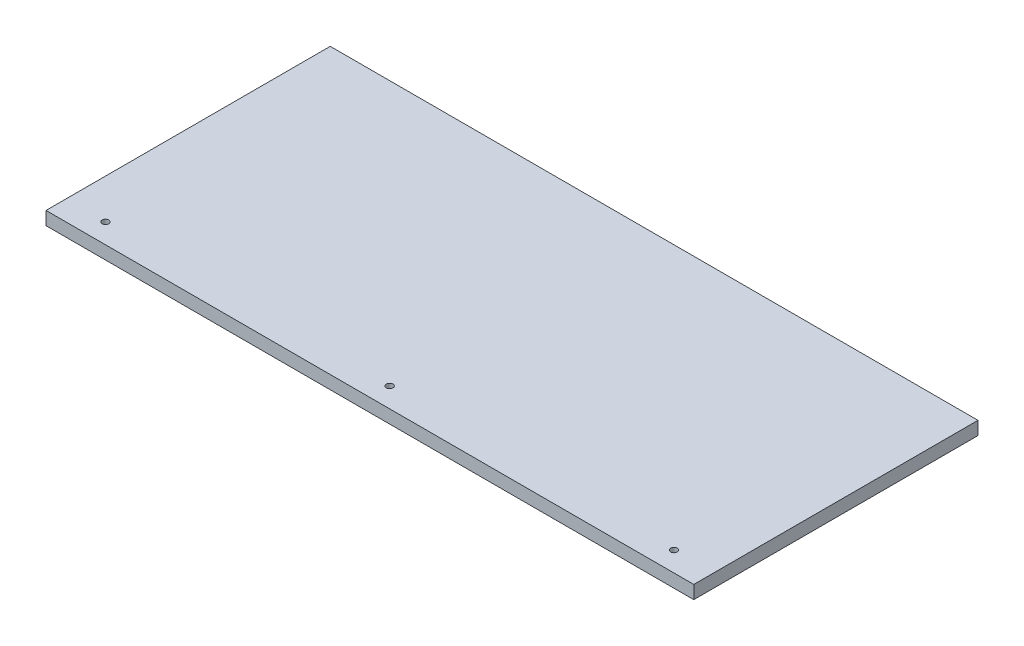
ISO-10303-21;
HEADER;
FILE_DESCRIPTION(('STEP AP214'),'2;1');
FILE_NAME('part.step','',(''),(''),'','','');
FILE_SCHEMA(('AUTOMOTIVE_DESIGN { 1 0 10303 214 1 1 1 1 }'));
ENDSEC;
DATA;
#1=APPLICATION_CONTEXT('core data for automotive mechanical design processes');
#2=APPLICATION_PROTOCOL_DEFINITION('international standard','automotive_design',2000,#1);
#3=PRODUCT_CONTEXT('',#1,'mechanical');
#4=PRODUCT('Part','Part','',(#3));
#5=PRODUCT_RELATED_PRODUCT_CATEGORY('part','',(#4));
#6=PRODUCT_DEFINITION_FORMATION('','',#4);
#7=PRODUCT_DEFINITION_CONTEXT('part definition',#1,'design');
#8=PRODUCT_DEFINITION('design','',#6,#7);
#9=PRODUCT_DEFINITION_SHAPE('','',#8);
#10=(LENGTH_UNIT() NAMED_UNIT(*) SI_UNIT(.MILLI.,.METRE.));
#11=(NAMED_UNIT(*) PLANE_ANGLE_UNIT() SI_UNIT($,.RADIAN.));
#12=(NAMED_UNIT(*) SI_UNIT($,.STERADIAN.) SOLID_ANGLE_UNIT());
#13=UNCERTAINTY_MEASURE_WITH_UNIT(LENGTH_MEASURE(1.E-05),#10,'distance_accuracy_value','');
#14=(GEOMETRIC_REPRESENTATION_CONTEXT(3) GLOBAL_UNCERTAINTY_ASSIGNED_CONTEXT((#13)) GLOBAL_UNIT_ASSIGNED_CONTEXT((#10,
#11,#12)) REPRESENTATION_CONTEXT('',''));
#15=CARTESIAN_POINT('',(0.,0.,0.));
#16=DIRECTION('',(0.,0.,1.));
#17=DIRECTION('',(1.,0.,0.));
#18=AXIS2_PLACEMENT_3D('',#15,#16,#17);
#19=CARTESIAN_POINT('',(0.,10.,0.));
#20=DIRECTION('',(1.,0.,0.));
#21=DIRECTION('',(0.,0.,-1.));
#22=AXIS2_PLACEMENT_3D('',#19,#20,#21);
#23=PLANE('',#22);
#24=DIRECTION('',(0.,0.,1.));
#25=VECTOR('',#24,1.);
#26=CARTESIAN_POINT('',(0.,0.,0.));
#27=LINE('',#26,#25);
#28=CARTESIAN_POINT('',(0.,0.,-215.));
#29=VERTEX_POINT('',#28);
#30=CARTESIAN_POINT('',(0.,0.,0.));
#31=VERTEX_POINT('',#30);
#32=EDGE_CURVE('E97',#29,#31,#27,.T.);
#33=ORIENTED_EDGE('',*,*,#32,.T.);
#34=DIRECTION('',(0.,-1.,0.));
#35=VECTOR('',#34,1.);
#36=CARTESIAN_POINT('',(0.,10.,0.));
#37=LINE('',#36,#35);
#38=CARTESIAN_POINT('',(0.,10.,0.));
#39=VERTEX_POINT('',#38);
#40=EDGE_CURVE('E11',#39,#31,#37,.T.);
#41=ORIENTED_EDGE('',*,*,#40,.F.);
#42=DIRECTION('',(0.,0.,1.));
#43=VECTOR('',#42,1.);
#44=CARTESIAN_POINT('',(0.,10.,0.));
#45=LINE('',#44,#43);
#46=CARTESIAN_POINT('',(0.,10.,-215.));
#47=VERTEX_POINT('',#46);
#48=EDGE_CURVE('E85',#47,#39,#45,.T.);
#49=ORIENTED_EDGE('',*,*,#48,.F.);
#50=DIRECTION('',(0.,-1.,0.));
#51=VECTOR('',#50,1.);
#52=CARTESIAN_POINT('',(0.,10.,-215.));
#53=LINE('',#52,#51);
#54=EDGE_CURVE('E93',#47,#29,#53,.T.);
#55=ORIENTED_EDGE('',*,*,#54,.T.);
#56=EDGE_LOOP('',(#33,#41,#49,#55));
#57=FACE_BOUND('',#56,.T.);
#58=ADVANCED_FACE('F34',(#57),#23,.F.);
#59=CARTESIAN_POINT('',(0.,10.,0.));
#60=DIRECTION('',(0.,0.,-1.));
#61=DIRECTION('',(-1.,0.,0.));
#62=AXIS2_PLACEMENT_3D('',#59,#60,#61);
#63=PLANE('',#62);
#64=DIRECTION('',(1.,0.,0.));
#65=VECTOR('',#64,1.);
#66=CARTESIAN_POINT('',(0.,0.,0.));
#67=LINE('',#66,#65);
#68=CARTESIAN_POINT('',(490.,0.,0.));
#69=VERTEX_POINT('',#68);
#70=EDGE_CURVE('E89',#31,#69,#67,.T.);
#71=ORIENTED_EDGE('',*,*,#70,.T.);
#72=DIRECTION('',(0.,-1.,0.));
#73=VECTOR('',#72,1.);
#74=CARTESIAN_POINT('',(490.,10.,0.));
#75=LINE('',#74,#73);
#76=CARTESIAN_POINT('',(490.,10.,0.));
#77=VERTEX_POINT('',#76);
#78=EDGE_CURVE('E42',#77,#69,#75,.T.);
#79=ORIENTED_EDGE('',*,*,#78,.F.);
#80=DIRECTION('',(1.,0.,0.));
#81=VECTOR('',#80,1.);
#82=CARTESIAN_POINT('',(0.,10.,0.));
#83=LINE('',#82,#81);
#84=EDGE_CURVE('E80',#39,#77,#83,.T.);
#85=ORIENTED_EDGE('',*,*,#84,.F.);
#86=ORIENTED_EDGE('',*,*,#40,.T.);
#87=EDGE_LOOP('',(#71,#79,#85,#86));
#88=FACE_BOUND('',#87,.T.);
#89=ADVANCED_FACE('F88',(#88),#63,.F.);
#90=CARTESIAN_POINT('',(490.,10.,0.));
#91=DIRECTION('',(-1.,0.,0.));
#92=DIRECTION('',(0.,0.,1.));
#93=AXIS2_PLACEMENT_3D('',#90,#91,#92);
#94=PLANE('',#93);
#95=DIRECTION('',(0.,0.,-1.));
#96=VECTOR('',#95,1.);
#97=CARTESIAN_POINT('',(490.,0.,0.));
#98=LINE('',#97,#96);
#99=CARTESIAN_POINT('',(490.,0.,-215.));
#100=VERTEX_POINT('',#99);
#101=EDGE_CURVE('E67',#69,#100,#98,.T.);
#102=ORIENTED_EDGE('',*,*,#101,.T.);
#103=DIRECTION('',(0.,-1.,0.));
#104=VECTOR('',#103,1.);
#105=CARTESIAN_POINT('',(490.,10.,-215.));
#106=LINE('',#105,#104);
#107=CARTESIAN_POINT('',(490.,10.,-215.));
#108=VERTEX_POINT('',#107);
#109=EDGE_CURVE('E90',#108,#100,#106,.T.);
#110=ORIENTED_EDGE('',*,*,#109,.F.);
#111=DIRECTION('',(0.,0.,-1.));
#112=VECTOR('',#111,1.);
#113=CARTESIAN_POINT('',(490.,10.,0.));
#114=LINE('',#113,#112);
#115=EDGE_CURVE('E83',#77,#108,#114,.T.);
#116=ORIENTED_EDGE('',*,*,#115,.F.);
#117=ORIENTED_EDGE('',*,*,#78,.T.);
#118=EDGE_LOOP('',(#102,#110,#116,#117));
#119=FACE_BOUND('',#118,.T.);
#120=ADVANCED_FACE('F91',(#119),#94,.F.);
#121=CARTESIAN_POINT('',(0.,10.,-215.));
#122=DIRECTION('',(0.,0.,1.));
#123=DIRECTION('',(1.,0.,0.));
#124=AXIS2_PLACEMENT_3D('',#121,#122,#123);
#125=PLANE('',#124);
#126=DIRECTION('',(-1.,0.,0.));
#127=VECTOR('',#126,1.);
#128=CARTESIAN_POINT('',(0.,0.,-215.));
#129=LINE('',#128,#127);
#130=EDGE_CURVE('E73',#100,#29,#129,.T.);
#131=ORIENTED_EDGE('',*,*,#130,.T.);
#132=ORIENTED_EDGE('',*,*,#54,.F.);
#133=DIRECTION('',(-1.,0.,0.));
#134=VECTOR('',#133,1.);
#135=CARTESIAN_POINT('',(0.,10.,-215.));
#136=LINE('',#135,#134);
#137=EDGE_CURVE('E50',#108,#47,#136,.T.);
#138=ORIENTED_EDGE('',*,*,#137,.F.);
#139=ORIENTED_EDGE('',*,*,#109,.T.);
#140=EDGE_LOOP('',(#131,#132,#138,#139));
#141=FACE_BOUND('',#140,.T.);
#142=ADVANCED_FACE('F105',(#141),#125,.F.);
#143=CARTESIAN_POINT('',(0.,10.,0.));
#144=DIRECTION('',(0.,-1.,0.));
#145=DIRECTION('',(0.,0.,-1.));
#146=AXIS2_PLACEMENT_3D('',#143,#144,#145);
#147=PLANE('',#146);
#148=CARTESIAN_POINT('',(29.9999999999999,10.,-15.));
#149=DIRECTION('',(0.,1.,0.));
#150=DIRECTION('',(0.,0.,1.));
#151=AXIS2_PLACEMENT_3D('',#148,#149,#150);
#152=CIRCLE('',#151,2.5);
#153=CARTESIAN_POINT('',(29.9999999999999,10.,-12.5));
#154=VERTEX_POINT('',#153);
#155=EDGE_CURVE('E121',#154,#154,#152,.T.);
#156=ORIENTED_EDGE('',*,*,#155,.F.);
#157=EDGE_LOOP('',(#156));
#158=FACE_BOUND('',#157,.T.);
#159=CARTESIAN_POINT('',(460.,10.,-15.));
#160=DIRECTION('',(0.,1.,0.));
#161=DIRECTION('',(0.,0.,1.));
#162=AXIS2_PLACEMENT_3D('',#159,#160,#161);
#163=CIRCLE('',#162,2.50000000000002);
#164=CARTESIAN_POINT('',(460.,10.,-12.5));
#165=VERTEX_POINT('',#164);
#166=EDGE_CURVE('E114',#165,#165,#163,.T.);
#167=ORIENTED_EDGE('',*,*,#166,.F.);
#168=EDGE_LOOP('',(#167));
#169=FACE_BOUND('',#168,.T.);
#170=CARTESIAN_POINT('',(245.,10.,-15.));
#171=DIRECTION('',(0.,1.,0.));
#172=DIRECTION('',(0.,0.,1.));
#173=AXIS2_PLACEMENT_3D('',#170,#171,#172);
#174=CIRCLE('',#173,2.50000000000002);
#175=CARTESIAN_POINT('',(245.,10.,-12.5));
#176=VERTEX_POINT('',#175);
#177=EDGE_CURVE('E115',#176,#176,#174,.T.);
#178=ORIENTED_EDGE('',*,*,#177,.F.);
#179=EDGE_LOOP('',(#178));
#180=FACE_BOUND('',#179,.T.);
#181=ORIENTED_EDGE('',*,*,#48,.T.);
#182=ORIENTED_EDGE('',*,*,#84,.T.);
#183=ORIENTED_EDGE('',*,*,#115,.T.);
#184=ORIENTED_EDGE('',*,*,#137,.T.);
#185=EDGE_LOOP('',(#181,#182,#183,#184));
#186=FACE_BOUND('',#185,.T.);
#187=ADVANCED_FACE('F81',(#158,#169,#180,#186),#147,.F.);
#188=CARTESIAN_POINT('',(0.,0.,0.));
#189=DIRECTION('',(0.,-1.,0.));
#190=DIRECTION('',(0.,0.,-1.));
#191=AXIS2_PLACEMENT_3D('',#188,#189,#190);
#192=PLANE('',#191);
#193=CARTESIAN_POINT('',(29.9999999999999,0.,-15.));
#194=DIRECTION('',(0.,-1.,0.));
#195=DIRECTION('',(0.,0.,-1.));
#196=AXIS2_PLACEMENT_3D('',#193,#194,#195);
#197=CIRCLE('',#196,2.5);
#198=CARTESIAN_POINT('',(29.9999999999999,0.,-17.5));
#199=VERTEX_POINT('',#198);
#200=EDGE_CURVE('E100',#199,#199,#197,.F.);
#201=ORIENTED_EDGE('',*,*,#200,.T.);
#202=EDGE_LOOP('',(#201));
#203=FACE_BOUND('',#202,.T.);
#204=CARTESIAN_POINT('',(460.,0.,-15.));
#205=DIRECTION('',(0.,-1.,0.));
#206=DIRECTION('',(0.,0.,-1.));
#207=AXIS2_PLACEMENT_3D('',#204,#205,#206);
#208=CIRCLE('',#207,2.50000000000002);
#209=CARTESIAN_POINT('',(460.,0.,-17.5));
#210=VERTEX_POINT('',#209);
#211=EDGE_CURVE('E118',#210,#210,#208,.F.);
#212=ORIENTED_EDGE('',*,*,#211,.T.);
#213=EDGE_LOOP('',(#212));
#214=FACE_BOUND('',#213,.T.);
#215=CARTESIAN_POINT('',(245.,0.,-15.));
#216=DIRECTION('',(0.,-1.,0.));
#217=DIRECTION('',(0.,0.,-1.));
#218=AXIS2_PLACEMENT_3D('',#215,#216,#217);
#219=CIRCLE('',#218,2.50000000000002);
#220=CARTESIAN_POINT('',(245.,0.,-17.5));
#221=VERTEX_POINT('',#220);
#222=EDGE_CURVE('E111',#221,#221,#219,.F.);
#223=ORIENTED_EDGE('',*,*,#222,.T.);
#224=EDGE_LOOP('',(#223));
#225=FACE_BOUND('',#224,.T.);
#226=ORIENTED_EDGE('',*,*,#32,.F.);
#227=ORIENTED_EDGE('',*,*,#130,.F.);
#228=ORIENTED_EDGE('',*,*,#101,.F.);
#229=ORIENTED_EDGE('',*,*,#70,.F.);
#230=EDGE_LOOP('',(#226,#227,#228,#229));
#231=FACE_BOUND('',#230,.T.);
#232=ADVANCED_FACE('F108',(#203,#214,#225,#231),#192,.T.);
#233=CARTESIAN_POINT('',(245.,-7.07106781186555,-15.));
#234=DIRECTION('',(0.,1.,0.));
#235=DIRECTION('',(0.,0.,1.));
#236=AXIS2_PLACEMENT_3D('',#233,#234,#235);
#237=CYLINDRICAL_SURFACE('',#236,2.50000000000002);
#238=ORIENTED_EDGE('',*,*,#177,.T.);
#239=EDGE_LOOP('',(#238));
#240=FACE_BOUND('',#239,.T.);
#241=ORIENTED_EDGE('',*,*,#222,.F.);
#242=EDGE_LOOP('',(#241));
#243=FACE_BOUND('',#242,.T.);
#244=ADVANCED_FACE('F139',(#240,#243),#237,.F.);
#245=CARTESIAN_POINT('',(460.,-7.07106781186555,-15.));
#246=DIRECTION('',(0.,1.,0.));
#247=DIRECTION('',(0.,0.,1.));
#248=AXIS2_PLACEMENT_3D('',#245,#246,#247);
#249=CYLINDRICAL_SURFACE('',#248,2.50000000000002);
#250=ORIENTED_EDGE('',*,*,#166,.T.);
#251=EDGE_LOOP('',(#250));
#252=FACE_BOUND('',#251,.T.);
#253=ORIENTED_EDGE('',*,*,#211,.F.);
#254=EDGE_LOOP('',(#253));
#255=FACE_BOUND('',#254,.T.);
#256=ADVANCED_FACE('F142',(#252,#255),#249,.F.);
#257=CARTESIAN_POINT('',(29.9999999999999,-7.07106781186555,-15.));
#258=DIRECTION('',(0.,1.,0.));
#259=DIRECTION('',(0.,0.,1.));
#260=AXIS2_PLACEMENT_3D('',#257,#258,#259);
#261=CYLINDRICAL_SURFACE('',#260,2.5);
#262=ORIENTED_EDGE('',*,*,#155,.T.);
#263=EDGE_LOOP('',(#262));
#264=FACE_BOUND('',#263,.T.);
#265=ORIENTED_EDGE('',*,*,#200,.F.);
#266=EDGE_LOOP('',(#265));
#267=FACE_BOUND('',#266,.T.);
#268=ADVANCED_FACE('F129',(#264,#267),#261,.F.);
#269=CLOSED_SHELL('',(#58,#89,#120,#142,#187,#232,#244,#256,#268));
#270=MANIFOLD_SOLID_BREP('B2',#269);
#271=ADVANCED_BREP_SHAPE_REPRESENTATION('',(#18,#270),#14);
#272=SHAPE_DEFINITION_REPRESENTATION(#9,#271);
ENDSEC;
END-ISO-10303-21;
